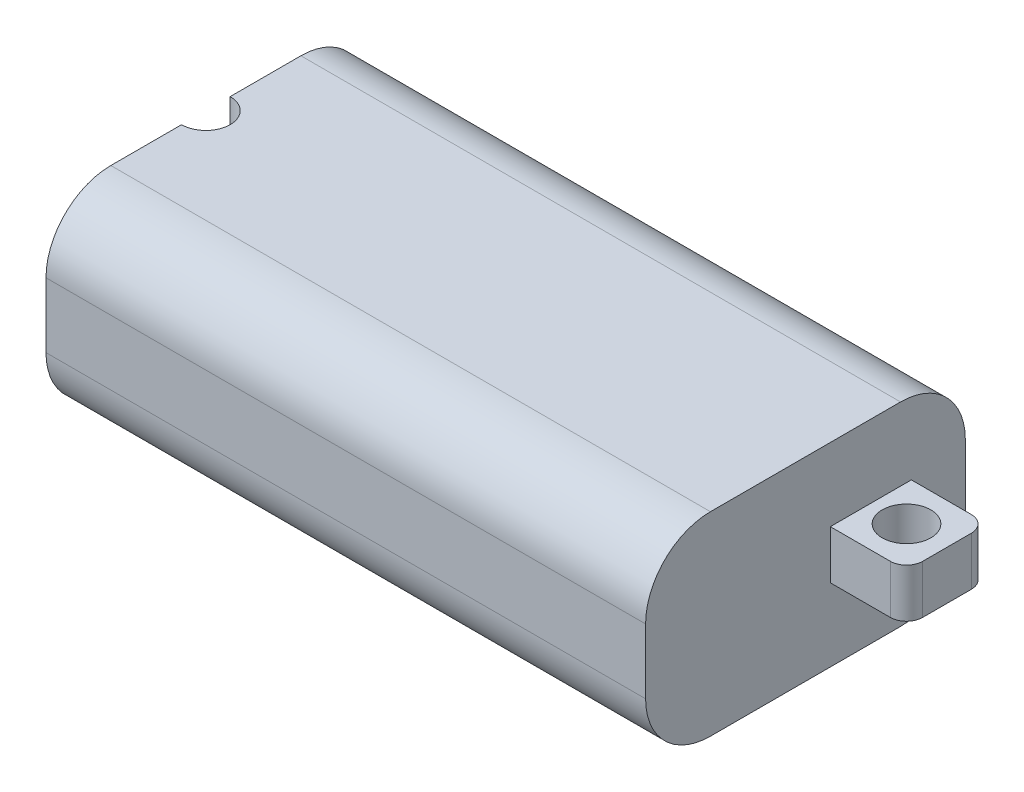
ISO-10303-21;
HEADER;
FILE_DESCRIPTION(('STEP AP214'),'2;1');
FILE_NAME('part.step','',(''),(''),'','','');
FILE_SCHEMA(('AUTOMOTIVE_DESIGN { 1 0 10303 214 1 1 1 1 }'));
ENDSEC;
DATA;
#1=APPLICATION_CONTEXT('core data for automotive mechanical design processes');
#2=APPLICATION_PROTOCOL_DEFINITION('international standard','automotive_design',2000,#1);
#3=PRODUCT_CONTEXT('',#1,'mechanical');
#4=PRODUCT('Part','Part','',(#3));
#5=PRODUCT_RELATED_PRODUCT_CATEGORY('part','',(#4));
#6=PRODUCT_DEFINITION_FORMATION('','',#4);
#7=PRODUCT_DEFINITION_CONTEXT('part definition',#1,'design');
#8=PRODUCT_DEFINITION('design','',#6,#7);
#9=PRODUCT_DEFINITION_SHAPE('','',#8);
#10=(LENGTH_UNIT() NAMED_UNIT(*) SI_UNIT(.MILLI.,.METRE.));
#11=(NAMED_UNIT(*) PLANE_ANGLE_UNIT() SI_UNIT($,.RADIAN.));
#12=(NAMED_UNIT(*) SI_UNIT($,.STERADIAN.) SOLID_ANGLE_UNIT());
#13=UNCERTAINTY_MEASURE_WITH_UNIT(LENGTH_MEASURE(1.E-05),#10,'distance_accuracy_value','');
#14=(GEOMETRIC_REPRESENTATION_CONTEXT(3) GLOBAL_UNCERTAINTY_ASSIGNED_CONTEXT((#13)) GLOBAL_UNIT_ASSIGNED_CONTEXT((#10,
#11,#12)) REPRESENTATION_CONTEXT('',''));
#15=CARTESIAN_POINT('',(0.,0.,0.));
#16=DIRECTION('',(0.,0.,1.));
#17=DIRECTION('',(1.,0.,0.));
#18=AXIS2_PLACEMENT_3D('',#15,#16,#17);
#19=CARTESIAN_POINT('',(18.5,12.,9.86499999999999));
#20=DIRECTION('',(-1.,0.,0.));
#21=DIRECTION('',(0.,0.,1.));
#22=AXIS2_PLACEMENT_3D('',#19,#20,#21);
#23=PLANE('',#22);
#24=DIRECTION('',(0.,0.,-1.));
#25=VECTOR('',#24,1.);
#26=CARTESIAN_POINT('',(18.5,0.,9.86499999999999));
#27=LINE('',#26,#25);
#28=CARTESIAN_POINT('',(18.5,0.,5.86499999999999));
#29=VERTEX_POINT('',#28);
#30=CARTESIAN_POINT('',(18.5,0.,-5.86500000000001));
#31=VERTEX_POINT('',#30);
#32=EDGE_CURVE('E234',#29,#31,#27,.T.);
#33=ORIENTED_EDGE('',*,*,#32,.T.);
#34=CARTESIAN_POINT('',(18.5,4.,-5.86500000000001));
#35=DIRECTION('',(-1.,0.,0.));
#36=DIRECTION('',(0.,0.,1.));
#37=AXIS2_PLACEMENT_3D('',#34,#35,#36);
#38=CIRCLE('',#37,4.);
#39=CARTESIAN_POINT('',(18.5,4.,-9.86500000000001));
#40=VERTEX_POINT('',#39);
#41=EDGE_CURVE('E281',#31,#40,#38,.F.);
#42=ORIENTED_EDGE('',*,*,#41,.T.);
#43=DIRECTION('',(0.,-1.,0.));
#44=VECTOR('',#43,1.);
#45=CARTESIAN_POINT('',(18.5,12.,-9.86500000000001));
#46=LINE('',#45,#44);
#47=CARTESIAN_POINT('',(18.5,8.,-9.86500000000001));
#48=VERTEX_POINT('',#47);
#49=EDGE_CURVE('E241',#48,#40,#46,.T.);
#50=ORIENTED_EDGE('',*,*,#49,.F.);
#51=CARTESIAN_POINT('',(18.5,8.,-5.86500000000001));
#52=DIRECTION('',(-1.,0.,0.));
#53=DIRECTION('',(0.,0.,1.));
#54=AXIS2_PLACEMENT_3D('',#51,#52,#53);
#55=CIRCLE('',#54,4.);
#56=CARTESIAN_POINT('',(18.5,12.,-5.86500000000001));
#57=VERTEX_POINT('',#56);
#58=EDGE_CURVE('E278',#48,#57,#55,.F.);
#59=ORIENTED_EDGE('',*,*,#58,.T.);
#60=DIRECTION('',(0.,0.,-1.));
#61=VECTOR('',#60,1.);
#62=CARTESIAN_POINT('',(18.5,12.,9.86499999999999));
#63=LINE('',#62,#61);
#64=CARTESIAN_POINT('',(18.5,12.,5.86499999999999));
#65=VERTEX_POINT('',#64);
#66=EDGE_CURVE('E225',#65,#57,#63,.T.);
#67=ORIENTED_EDGE('',*,*,#66,.F.);
#68=CARTESIAN_POINT('',(18.5,8.,5.86499999999999));
#69=DIRECTION('',(-1.,0.,0.));
#70=DIRECTION('',(0.,0.,1.));
#71=AXIS2_PLACEMENT_3D('',#68,#69,#70);
#72=CIRCLE('',#71,4.);
#73=CARTESIAN_POINT('',(18.5,8.,9.86499999999999));
#74=VERTEX_POINT('',#73);
#75=EDGE_CURVE('E272',#65,#74,#72,.F.);
#76=ORIENTED_EDGE('',*,*,#75,.T.);
#77=DIRECTION('',(0.,-1.,0.));
#78=VECTOR('',#77,1.);
#79=CARTESIAN_POINT('',(18.5,12.,9.86499999999999));
#80=LINE('',#79,#78);
#81=CARTESIAN_POINT('',(18.5,4.,9.86499999999999));
#82=VERTEX_POINT('',#81);
#83=EDGE_CURVE('E245',#74,#82,#80,.T.);
#84=ORIENTED_EDGE('',*,*,#83,.T.);
#85=CARTESIAN_POINT('',(18.5,4.,5.86499999999999));
#86=DIRECTION('',(-1.,0.,0.));
#87=DIRECTION('',(0.,0.,1.));
#88=AXIS2_PLACEMENT_3D('',#85,#86,#87);
#89=CIRCLE('',#88,4.);
#90=EDGE_CURVE('E275',#82,#29,#89,.F.);
#91=ORIENTED_EDGE('',*,*,#90,.T.);
#92=EDGE_LOOP('',(#33,#42,#50,#59,#67,#76,#84,#91));
#93=FACE_BOUND('',#92,.T.);
#94=DIRECTION('',(0.,1.,0.));
#95=VECTOR('',#94,1.);
#96=CARTESIAN_POINT('',(18.5,4.5,-6.53500000000001));
#97=LINE('',#96,#95);
#98=CARTESIAN_POINT('',(18.5,4.5,-6.53500000000001));
#99=VERTEX_POINT('',#98);
#100=CARTESIAN_POINT('',(18.5,7.5,-6.535));
#101=VERTEX_POINT('',#100);
#102=EDGE_CURVE('E156',#99,#101,#97,.T.);
#103=ORIENTED_EDGE('',*,*,#102,.F.);
#104=DIRECTION('',(0.,0.,-1.));
#105=VECTOR('',#104,1.);
#106=CARTESIAN_POINT('',(18.5,4.5,-1.53500000000001));
#107=LINE('',#106,#105);
#108=CARTESIAN_POINT('',(18.5,4.5,-1.53500000000001));
#109=VERTEX_POINT('',#108);
#110=EDGE_CURVE('E169',#109,#99,#107,.T.);
#111=ORIENTED_EDGE('',*,*,#110,.F.);
#112=DIRECTION('',(0.,-1.,0.));
#113=VECTOR('',#112,1.);
#114=CARTESIAN_POINT('',(18.5,4.5,-1.53500000000001));
#115=LINE('',#114,#113);
#116=CARTESIAN_POINT('',(18.5,7.5,-1.53500000000001));
#117=VERTEX_POINT('',#116);
#118=EDGE_CURVE('E180',#117,#109,#115,.T.);
#119=ORIENTED_EDGE('',*,*,#118,.F.);
#120=DIRECTION('',(0.,0.,1.));
#121=VECTOR('',#120,1.);
#122=CARTESIAN_POINT('',(18.5,7.5,-1.53500000000001));
#123=LINE('',#122,#121);
#124=EDGE_CURVE('E172',#101,#117,#123,.T.);
#125=ORIENTED_EDGE('',*,*,#124,.F.);
#126=EDGE_LOOP('',(#103,#111,#119,#125));
#127=FACE_BOUND('',#126,.T.);
#128=ADVANCED_FACE('F39',(#93,#127),#23,.F.);
#129=CARTESIAN_POINT('',(-18.5,12.,9.865));
#130=DIRECTION('',(1.,0.,0.));
#131=DIRECTION('',(0.,0.,-1.));
#132=AXIS2_PLACEMENT_3D('',#129,#130,#131);
#133=PLANE('',#132);
#134=CARTESIAN_POINT('',(-18.5,6.,-4.035));
#135=DIRECTION('',(-1.,0.,0.));
#136=DIRECTION('',(0.,0.,1.));
#137=AXIS2_PLACEMENT_3D('',#134,#135,#136);
#138=CIRCLE('',#137,2.5);
#139=CARTESIAN_POINT('',(-18.5,6.,-1.535));
#140=VERTEX_POINT('',#139);
#141=EDGE_CURVE('E197',#140,#140,#138,.T.);
#142=ORIENTED_EDGE('',*,*,#141,.F.);
#143=EDGE_LOOP('',(#142));
#144=FACE_BOUND('',#143,.T.);
#145=DIRECTION('',(0.,-1.,0.));
#146=VECTOR('',#145,1.);
#147=CARTESIAN_POINT('',(-18.5,12.,-9.865));
#148=LINE('',#147,#146);
#149=CARTESIAN_POINT('',(-18.5,8.,-9.865));
#150=VERTEX_POINT('',#149);
#151=CARTESIAN_POINT('',(-18.5,4.,-9.865));
#152=VERTEX_POINT('',#151);
#153=EDGE_CURVE('E230',#150,#152,#148,.T.);
#154=ORIENTED_EDGE('',*,*,#153,.T.);
#155=CARTESIAN_POINT('',(-18.5,4.,-5.865));
#156=DIRECTION('',(1.,0.,0.));
#157=DIRECTION('',(0.,0.,-1.));
#158=AXIS2_PLACEMENT_3D('',#155,#156,#157);
#159=CIRCLE('',#158,4.);
#160=CARTESIAN_POINT('',(-18.5,0.,-5.86499999999999));
#161=VERTEX_POINT('',#160);
#162=EDGE_CURVE('E263',#152,#161,#159,.F.);
#163=ORIENTED_EDGE('',*,*,#162,.T.);
#164=DIRECTION('',(0.,0.,1.));
#165=VECTOR('',#164,1.);
#166=CARTESIAN_POINT('',(-18.5,0.,9.865));
#167=LINE('',#166,#165);
#168=CARTESIAN_POINT('',(-18.5,0.,-1.50000000000001));
#169=VERTEX_POINT('',#168);
#170=EDGE_CURVE('E231',#161,#169,#167,.T.);
#171=ORIENTED_EDGE('',*,*,#170,.T.);
#172=DIRECTION('',(0.,1.,0.));
#173=VECTOR('',#172,1.);
#174=CARTESIAN_POINT('',(-18.5,0.,-1.50000000000001));
#175=LINE('',#174,#173);
#176=CARTESIAN_POINT('',(-18.5,12.,-1.50000000000001));
#177=VERTEX_POINT('',#176);
#178=EDGE_CURVE('E217',#169,#177,#175,.T.);
#179=ORIENTED_EDGE('',*,*,#178,.T.);
#180=DIRECTION('',(0.,0.,1.));
#181=VECTOR('',#180,1.);
#182=CARTESIAN_POINT('',(-18.5,12.,9.865));
#183=LINE('',#182,#181);
#184=CARTESIAN_POINT('',(-18.5,12.,-5.86499999999999));
#185=VERTEX_POINT('',#184);
#186=EDGE_CURVE('E222',#185,#177,#183,.T.);
#187=ORIENTED_EDGE('',*,*,#186,.F.);
#188=CARTESIAN_POINT('',(-18.5,8.,-5.865));
#189=DIRECTION('',(1.,0.,0.));
#190=DIRECTION('',(0.,0.,-1.));
#191=AXIS2_PLACEMENT_3D('',#188,#189,#190);
#192=CIRCLE('',#191,4.);
#193=EDGE_CURVE('E260',#185,#150,#192,.F.);
#194=ORIENTED_EDGE('',*,*,#193,.T.);
#195=EDGE_LOOP('',(#154,#163,#171,#179,#187,#194));
#196=FACE_BOUND('',#195,.T.);
#197=ADVANCED_FACE('F358',(#144,#196),#133,.F.);
#198=CARTESIAN_POINT('',(-18.5,0.,1.5));
#199=VERTEX_POINT('',#198);
#200=CARTESIAN_POINT('',(-18.5,0.,5.865));
#201=VERTEX_POINT('',#200);
#202=EDGE_CURVE('E221',#199,#201,#167,.T.);
#203=ORIENTED_EDGE('',*,*,#202,.T.);
#204=CARTESIAN_POINT('',(-18.5,4.,5.865));
#205=DIRECTION('',(1.,0.,0.));
#206=DIRECTION('',(0.,0.,-1.));
#207=AXIS2_PLACEMENT_3D('',#204,#205,#206);
#208=CIRCLE('',#207,4.);
#209=CARTESIAN_POINT('',(-18.5,4.,9.865));
#210=VERTEX_POINT('',#209);
#211=EDGE_CURVE('E302',#201,#210,#208,.F.);
#212=ORIENTED_EDGE('',*,*,#211,.T.);
#213=DIRECTION('',(0.,-1.,0.));
#214=VECTOR('',#213,1.);
#215=CARTESIAN_POINT('',(-18.5,12.,9.865));
#216=LINE('',#215,#214);
#217=CARTESIAN_POINT('',(-18.5,8.,9.865));
#218=VERTEX_POINT('',#217);
#219=EDGE_CURVE('E249',#218,#210,#216,.T.);
#220=ORIENTED_EDGE('',*,*,#219,.F.);
#221=CARTESIAN_POINT('',(-18.5,8.,5.865));
#222=DIRECTION('',(1.,0.,0.));
#223=DIRECTION('',(0.,0.,-1.));
#224=AXIS2_PLACEMENT_3D('',#221,#222,#223);
#225=CIRCLE('',#224,4.);
#226=CARTESIAN_POINT('',(-18.5,12.,5.865));
#227=VERTEX_POINT('',#226);
#228=EDGE_CURVE('E299',#218,#227,#225,.F.);
#229=ORIENTED_EDGE('',*,*,#228,.T.);
#230=CARTESIAN_POINT('',(-18.5,12.,1.5));
#231=VERTEX_POINT('',#230);
#232=EDGE_CURVE('E226',#231,#227,#183,.T.);
#233=ORIENTED_EDGE('',*,*,#232,.F.);
#234=DIRECTION('',(0.,1.,0.));
#235=VECTOR('',#234,1.);
#236=CARTESIAN_POINT('',(-18.5,0.,1.5));
#237=LINE('',#236,#235);
#238=EDGE_CURVE('E210',#231,#199,#237,.F.);
#239=ORIENTED_EDGE('',*,*,#238,.T.);
#240=EDGE_LOOP('',(#203,#212,#220,#229,#233,#239));
#241=FACE_BOUND('',#240,.T.);
#242=ADVANCED_FACE('F364',(#241),#133,.F.);
#243=CARTESIAN_POINT('',(18.5,12.,9.86499999999999));
#244=DIRECTION('',(0.,0.,-1.));
#245=DIRECTION('',(-1.,0.,0.));
#246=AXIS2_PLACEMENT_3D('',#243,#244,#245);
#247=PLANE('',#246);
#248=ORIENTED_EDGE('',*,*,#219,.T.);
#249=DIRECTION('',(1.,0.,0.));
#250=VECTOR('',#249,1.);
#251=CARTESIAN_POINT('',(18.5,4.,9.86499999999999));
#252=LINE('',#251,#250);
#253=EDGE_CURVE('E295',#210,#82,#252,.T.);
#254=ORIENTED_EDGE('',*,*,#253,.T.);
#255=ORIENTED_EDGE('',*,*,#83,.F.);
#256=DIRECTION('',(1.,0.,0.));
#257=VECTOR('',#256,1.);
#258=CARTESIAN_POINT('',(-18.5,8.,9.865));
#259=LINE('',#258,#257);
#260=EDGE_CURVE('E292',#74,#218,#259,.F.);
#261=ORIENTED_EDGE('',*,*,#260,.T.);
#262=EDGE_LOOP('',(#248,#254,#255,#261));
#263=FACE_BOUND('',#262,.T.);
#264=ADVANCED_FACE('F371',(#263),#247,.F.);
#265=CARTESIAN_POINT('',(18.5,12.,-9.86500000000001));
#266=DIRECTION('',(0.,0.,1.));
#267=DIRECTION('',(1.,0.,0.));
#268=AXIS2_PLACEMENT_3D('',#265,#266,#267);
#269=PLANE('',#268);
#270=ORIENTED_EDGE('',*,*,#49,.T.);
#271=DIRECTION('',(-1.,0.,0.));
#272=VECTOR('',#271,1.);
#273=CARTESIAN_POINT('',(18.5,4.,-9.86500000000001));
#274=LINE('',#273,#272);
#275=EDGE_CURVE('E256',#40,#152,#274,.T.);
#276=ORIENTED_EDGE('',*,*,#275,.T.);
#277=ORIENTED_EDGE('',*,*,#153,.F.);
#278=DIRECTION('',(-1.,0.,0.));
#279=VECTOR('',#278,1.);
#280=CARTESIAN_POINT('',(18.5,8.,-9.86500000000001));
#281=LINE('',#280,#279);
#282=EDGE_CURVE('E253',#150,#48,#281,.F.);
#283=ORIENTED_EDGE('',*,*,#282,.T.);
#284=EDGE_LOOP('',(#270,#276,#277,#283));
#285=FACE_BOUND('',#284,.T.);
#286=ADVANCED_FACE('F369',(#285),#269,.F.);
#287=CARTESIAN_POINT('',(0.,12.,0.));
#288=DIRECTION('',(0.,1.,0.));
#289=DIRECTION('',(0.,0.,1.));
#290=AXIS2_PLACEMENT_3D('',#287,#288,#289);
#291=PLANE('',#290);
#292=ORIENTED_EDGE('',*,*,#66,.T.);
#293=DIRECTION('',(-1.,0.,0.));
#294=VECTOR('',#293,1.);
#295=CARTESIAN_POINT('',(-18.5,12.,-5.865));
#296=LINE('',#295,#294);
#297=EDGE_CURVE('E288',#57,#185,#296,.T.);
#298=ORIENTED_EDGE('',*,*,#297,.T.);
#299=ORIENTED_EDGE('',*,*,#186,.T.);
#300=CARTESIAN_POINT('',(-18.5,12.,0.));
#301=DIRECTION('',(0.,1.,0.));
#302=DIRECTION('',(0.,0.,1.));
#303=AXIS2_PLACEMENT_3D('',#300,#301,#302);
#304=CIRCLE('',#303,1.5);
#305=EDGE_CURVE('E202',#231,#177,#304,.T.);
#306=ORIENTED_EDGE('',*,*,#305,.F.);
#307=ORIENTED_EDGE('',*,*,#232,.T.);
#308=DIRECTION('',(1.,0.,0.));
#309=VECTOR('',#308,1.);
#310=CARTESIAN_POINT('',(18.5,12.,5.86499999999999));
#311=LINE('',#310,#309);
#312=EDGE_CURVE('E284',#227,#65,#311,.T.);
#313=ORIENTED_EDGE('',*,*,#312,.T.);
#314=EDGE_LOOP('',(#292,#298,#299,#306,#307,#313));
#315=FACE_BOUND('',#314,.T.);
#316=ADVANCED_FACE('F497',(#315),#291,.T.);
#317=CARTESIAN_POINT('',(0.,0.,0.));
#318=DIRECTION('',(0.,1.,0.));
#319=DIRECTION('',(0.,0.,1.));
#320=AXIS2_PLACEMENT_3D('',#317,#318,#319);
#321=PLANE('',#320);
#322=ORIENTED_EDGE('',*,*,#170,.F.);
#323=DIRECTION('',(-1.,0.,0.));
#324=VECTOR('',#323,1.);
#325=CARTESIAN_POINT('',(0.,0.,-5.86500000000001));
#326=LINE('',#325,#324);
#327=EDGE_CURVE('E269',#161,#31,#326,.F.);
#328=ORIENTED_EDGE('',*,*,#327,.T.);
#329=ORIENTED_EDGE('',*,*,#32,.F.);
#330=DIRECTION('',(1.,0.,0.));
#331=VECTOR('',#330,1.);
#332=CARTESIAN_POINT('',(0.,0.,5.865));
#333=LINE('',#332,#331);
#334=EDGE_CURVE('E266',#29,#201,#333,.F.);
#335=ORIENTED_EDGE('',*,*,#334,.T.);
#336=ORIENTED_EDGE('',*,*,#202,.F.);
#337=CARTESIAN_POINT('',(-18.5,0.,0.));
#338=DIRECTION('',(0.,1.,0.));
#339=DIRECTION('',(0.,0.,1.));
#340=AXIS2_PLACEMENT_3D('',#337,#338,#339);
#341=CIRCLE('',#340,1.5);
#342=EDGE_CURVE('E206',#199,#169,#341,.T.);
#343=ORIENTED_EDGE('',*,*,#342,.T.);
#344=EDGE_LOOP('',(#322,#328,#329,#335,#336,#343));
#345=FACE_BOUND('',#344,.T.);
#346=ADVANCED_FACE('F489',(#345),#321,.F.);
#347=CARTESIAN_POINT('',(-18.5,0.,0.));
#348=DIRECTION('',(0.,1.,0.));
#349=DIRECTION('',(0.,0.,1.));
#350=AXIS2_PLACEMENT_3D('',#347,#348,#349);
#351=CYLINDRICAL_SURFACE('',#350,1.5);
#352=ORIENTED_EDGE('',*,*,#342,.F.);
#353=ORIENTED_EDGE('',*,*,#238,.F.);
#354=ORIENTED_EDGE('',*,*,#305,.T.);
#355=ORIENTED_EDGE('',*,*,#178,.F.);
#356=EDGE_LOOP('',(#352,#353,#354,#355));
#357=FACE_BOUND('',#356,.T.);
#358=ADVANCED_FACE('F381',(#357),#351,.F.);
#359=CARTESIAN_POINT('',(18.5,4.,-5.86500000000001));
#360=DIRECTION('',(-1.,0.,0.));
#361=DIRECTION('',(0.,0.,1.));
#362=AXIS2_PLACEMENT_3D('',#359,#360,#361);
#363=CYLINDRICAL_SURFACE('',#362,4.);
#364=ORIENTED_EDGE('',*,*,#41,.F.);
#365=ORIENTED_EDGE('',*,*,#327,.F.);
#366=ORIENTED_EDGE('',*,*,#162,.F.);
#367=ORIENTED_EDGE('',*,*,#275,.F.);
#368=EDGE_LOOP('',(#364,#365,#366,#367));
#369=FACE_BOUND('',#368,.T.);
#370=ADVANCED_FACE('F377',(#369),#363,.T.);
#371=CARTESIAN_POINT('',(0.,8.,-5.86500000000001));
#372=DIRECTION('',(1.,0.,0.));
#373=DIRECTION('',(0.,0.,-1.));
#374=AXIS2_PLACEMENT_3D('',#371,#372,#373);
#375=CYLINDRICAL_SURFACE('',#374,4.);
#376=ORIENTED_EDGE('',*,*,#58,.F.);
#377=ORIENTED_EDGE('',*,*,#282,.F.);
#378=ORIENTED_EDGE('',*,*,#193,.F.);
#379=ORIENTED_EDGE('',*,*,#297,.F.);
#380=EDGE_LOOP('',(#376,#377,#378,#379));
#381=FACE_BOUND('',#380,.T.);
#382=ADVANCED_FACE('F380',(#381),#375,.T.);
#383=CARTESIAN_POINT('',(18.5,4.,5.86499999999999));
#384=DIRECTION('',(1.,0.,0.));
#385=DIRECTION('',(0.,0.,-1.));
#386=AXIS2_PLACEMENT_3D('',#383,#384,#385);
#387=CYLINDRICAL_SURFACE('',#386,4.);
#388=ORIENTED_EDGE('',*,*,#211,.F.);
#389=ORIENTED_EDGE('',*,*,#334,.F.);
#390=ORIENTED_EDGE('',*,*,#90,.F.);
#391=ORIENTED_EDGE('',*,*,#253,.F.);
#392=EDGE_LOOP('',(#388,#389,#390,#391));
#393=FACE_BOUND('',#392,.T.);
#394=ADVANCED_FACE('F385',(#393),#387,.T.);
#395=CARTESIAN_POINT('',(0.,8.,5.865));
#396=DIRECTION('',(-1.,0.,0.));
#397=DIRECTION('',(0.,0.,1.));
#398=AXIS2_PLACEMENT_3D('',#395,#396,#397);
#399=CYLINDRICAL_SURFACE('',#398,4.);
#400=ORIENTED_EDGE('',*,*,#228,.F.);
#401=ORIENTED_EDGE('',*,*,#260,.F.);
#402=ORIENTED_EDGE('',*,*,#75,.F.);
#403=ORIENTED_EDGE('',*,*,#312,.F.);
#404=EDGE_LOOP('',(#400,#401,#402,#403));
#405=FACE_BOUND('',#404,.T.);
#406=ADVANCED_FACE('F389',(#405),#399,.T.);
#407=CARTESIAN_POINT('',(11.5,6.,-4.035));
#408=DIRECTION('',(-1.,0.,0.));
#409=DIRECTION('',(0.,0.,1.));
#410=AXIS2_PLACEMENT_3D('',#407,#408,#409);
#411=CYLINDRICAL_SURFACE('',#410,2.5);
#412=CARTESIAN_POINT('',(11.5,6.,-4.035));
#413=DIRECTION('',(-1.,0.,0.));
#414=DIRECTION('',(0.,0.,1.));
#415=AXIS2_PLACEMENT_3D('',#412,#413,#414);
#416=CIRCLE('',#415,2.5);
#417=CARTESIAN_POINT('',(11.5,6.,-1.535));
#418=VERTEX_POINT('',#417);
#419=EDGE_CURVE('E198',#418,#418,#416,.T.);
#420=ORIENTED_EDGE('',*,*,#419,.F.);
#421=EDGE_LOOP('',(#420));
#422=FACE_BOUND('',#421,.T.);
#423=ORIENTED_EDGE('',*,*,#141,.T.);
#424=EDGE_LOOP('',(#423));
#425=FACE_BOUND('',#424,.T.);
#426=ADVANCED_FACE('F392',(#422,#425),#411,.F.);
#427=CARTESIAN_POINT('',(11.5,6.,-4.035));
#428=DIRECTION('',(-1.,0.,0.));
#429=DIRECTION('',(0.,0.,1.));
#430=AXIS2_PLACEMENT_3D('',#427,#428,#429);
#431=PLANE('',#430);
#432=ORIENTED_EDGE('',*,*,#419,.T.);
#433=EDGE_LOOP('',(#432));
#434=FACE_BOUND('',#433,.T.);
#435=ADVANCED_FACE('F355',(#434),#431,.T.);
#436=CARTESIAN_POINT('',(23.2,4.5,-6.53500000000001));
#437=DIRECTION('',(0.,0.,1.));
#438=DIRECTION('',(1.,0.,0.));
#439=AXIS2_PLACEMENT_3D('',#436,#437,#438);
#440=PLANE('',#439);
#441=DIRECTION('',(-1.,0.,0.));
#442=VECTOR('',#441,1.);
#443=CARTESIAN_POINT('',(23.2,7.5,-6.53500000000001));
#444=LINE('',#443,#442);
#445=CARTESIAN_POINT('',(22.2,7.5,-6.53500000000001));
#446=VERTEX_POINT('',#445);
#447=EDGE_CURVE('E194',#446,#101,#444,.T.);
#448=ORIENTED_EDGE('',*,*,#447,.F.);
#449=DIRECTION('',(0.,1.,0.));
#450=VECTOR('',#449,1.);
#451=CARTESIAN_POINT('',(22.2,4.5,-6.53500000000001));
#452=LINE('',#451,#450);
#453=CARTESIAN_POINT('',(22.2,4.5,-6.53500000000001));
#454=VERTEX_POINT('',#453);
#455=EDGE_CURVE('E11',#446,#454,#452,.F.);
#456=ORIENTED_EDGE('',*,*,#455,.T.);
#457=DIRECTION('',(-1.,0.,0.));
#458=VECTOR('',#457,1.);
#459=CARTESIAN_POINT('',(23.2,4.5,-6.53500000000001));
#460=LINE('',#459,#458);
#461=EDGE_CURVE('E153',#454,#99,#460,.T.);
#462=ORIENTED_EDGE('',*,*,#461,.T.);
#463=ORIENTED_EDGE('',*,*,#102,.T.);
#464=EDGE_LOOP('',(#448,#456,#462,#463));
#465=FACE_BOUND('',#464,.T.);
#466=ADVANCED_FACE('F155',(#465),#440,.F.);
#467=CARTESIAN_POINT('',(23.2,7.5,-1.53500000000001));
#468=DIRECTION('',(0.,-1.,0.));
#469=DIRECTION('',(0.,0.,-1.));
#470=AXIS2_PLACEMENT_3D('',#467,#468,#469);
#471=PLANE('',#470);
#472=CARTESIAN_POINT('',(20.7,7.5,-4.03500000000001));
#473=DIRECTION('',(0.,1.,0.));
#474=DIRECTION('',(0.,0.,1.));
#475=AXIS2_PLACEMENT_3D('',#472,#473,#474);
#476=CIRCLE('',#475,1.5);
#477=CARTESIAN_POINT('',(20.7,7.5,-2.53500000000001));
#478=VERTEX_POINT('',#477);
#479=EDGE_CURVE('E309',#478,#478,#476,.T.);
#480=ORIENTED_EDGE('',*,*,#479,.F.);
#481=EDGE_LOOP('',(#480));
#482=FACE_BOUND('',#481,.T.);
#483=DIRECTION('',(-1.,0.,0.));
#484=VECTOR('',#483,1.);
#485=CARTESIAN_POINT('',(23.2,7.5,-1.53500000000001));
#486=LINE('',#485,#484);
#487=CARTESIAN_POINT('',(22.2,7.5,-1.53500000000001));
#488=VERTEX_POINT('',#487);
#489=EDGE_CURVE('E191',#488,#117,#486,.T.);
#490=ORIENTED_EDGE('',*,*,#489,.F.);
#491=CARTESIAN_POINT('',(22.2,7.5,-2.53500000000001));
#492=DIRECTION('',(0.,-1.,0.));
#493=DIRECTION('',(0.,0.,-1.));
#494=AXIS2_PLACEMENT_3D('',#491,#492,#493);
#495=CIRCLE('',#494,1.);
#496=CARTESIAN_POINT('',(23.2,7.5,-2.53500000000001));
#497=VERTEX_POINT('',#496);
#498=EDGE_CURVE('E48',#488,#497,#495,.F.);
#499=ORIENTED_EDGE('',*,*,#498,.T.);
#500=DIRECTION('',(0.,0.,1.));
#501=VECTOR('',#500,1.);
#502=CARTESIAN_POINT('',(23.2,7.5,-1.53500000000001));
#503=LINE('',#502,#501);
#504=CARTESIAN_POINT('',(23.2,7.5,-5.53500000000001));
#505=VERTEX_POINT('',#504);
#506=EDGE_CURVE('E179',#505,#497,#503,.T.);
#507=ORIENTED_EDGE('',*,*,#506,.F.);
#508=CARTESIAN_POINT('',(22.2,7.5,-5.53500000000001));
#509=DIRECTION('',(0.,-1.,0.));
#510=DIRECTION('',(0.,0.,-1.));
#511=AXIS2_PLACEMENT_3D('',#508,#509,#510);
#512=CIRCLE('',#511,1.);
#513=EDGE_CURVE('E55',#505,#446,#512,.F.);
#514=ORIENTED_EDGE('',*,*,#513,.T.);
#515=ORIENTED_EDGE('',*,*,#447,.T.);
#516=ORIENTED_EDGE('',*,*,#124,.T.);
#517=EDGE_LOOP('',(#490,#499,#507,#514,#515,#516));
#518=FACE_BOUND('',#517,.T.);
#519=ADVANCED_FACE('F328',(#482,#518),#471,.F.);
#520=CARTESIAN_POINT('',(23.2,4.5,-1.53500000000001));
#521=DIRECTION('',(0.,0.,-1.));
#522=DIRECTION('',(-1.,0.,0.));
#523=AXIS2_PLACEMENT_3D('',#520,#521,#522);
#524=PLANE('',#523);
#525=DIRECTION('',(-1.,0.,0.));
#526=VECTOR('',#525,1.);
#527=CARTESIAN_POINT('',(23.2,4.5,-1.53500000000001));
#528=LINE('',#527,#526);
#529=CARTESIAN_POINT('',(22.2,4.5,-1.53500000000001));
#530=VERTEX_POINT('',#529);
#531=EDGE_CURVE('E162',#530,#109,#528,.T.);
#532=ORIENTED_EDGE('',*,*,#531,.F.);
#533=DIRECTION('',(0.,-1.,0.));
#534=VECTOR('',#533,1.);
#535=CARTESIAN_POINT('',(22.2,4.5,-1.53500000000001));
#536=LINE('',#535,#534);
#537=EDGE_CURVE('E63',#530,#488,#536,.F.);
#538=ORIENTED_EDGE('',*,*,#537,.T.);
#539=ORIENTED_EDGE('',*,*,#489,.T.);
#540=ORIENTED_EDGE('',*,*,#118,.T.);
#541=EDGE_LOOP('',(#532,#538,#539,#540));
#542=FACE_BOUND('',#541,.T.);
#543=ADVANCED_FACE('F336',(#542),#524,.F.);
#544=CARTESIAN_POINT('',(23.2,4.5,-1.53500000000001));
#545=DIRECTION('',(0.,1.,0.));
#546=DIRECTION('',(0.,0.,1.));
#547=AXIS2_PLACEMENT_3D('',#544,#545,#546);
#548=PLANE('',#547);
#549=CARTESIAN_POINT('',(20.7,4.5,-4.03500000000001));
#550=DIRECTION('',(0.,1.,0.));
#551=DIRECTION('',(0.,0.,1.));
#552=AXIS2_PLACEMENT_3D('',#549,#550,#551);
#553=CIRCLE('',#552,1.5);
#554=CARTESIAN_POINT('',(20.7,4.5,-2.53500000000001));
#555=VERTEX_POINT('',#554);
#556=EDGE_CURVE('E174',#555,#555,#553,.T.);
#557=ORIENTED_EDGE('',*,*,#556,.T.);
#558=EDGE_LOOP('',(#557));
#559=FACE_BOUND('',#558,.T.);
#560=DIRECTION('',(0.,0.,-1.));
#561=VECTOR('',#560,1.);
#562=CARTESIAN_POINT('',(23.2,4.5,-1.53500000000001));
#563=LINE('',#562,#561);
#564=CARTESIAN_POINT('',(23.2,4.5,-2.53500000000001));
#565=VERTEX_POINT('',#564);
#566=CARTESIAN_POINT('',(23.2,4.5,-5.53500000000001));
#567=VERTEX_POINT('',#566);
#568=EDGE_CURVE('E163',#565,#567,#563,.T.);
#569=ORIENTED_EDGE('',*,*,#568,.F.);
#570=CARTESIAN_POINT('',(22.2,4.5,-2.53500000000001));
#571=DIRECTION('',(0.,1.,0.));
#572=DIRECTION('',(0.,0.,1.));
#573=AXIS2_PLACEMENT_3D('',#570,#571,#572);
#574=CIRCLE('',#573,1.);
#575=EDGE_CURVE('E320',#565,#530,#574,.F.);
#576=ORIENTED_EDGE('',*,*,#575,.T.);
#577=ORIENTED_EDGE('',*,*,#531,.T.);
#578=ORIENTED_EDGE('',*,*,#110,.T.);
#579=ORIENTED_EDGE('',*,*,#461,.F.);
#580=CARTESIAN_POINT('',(22.2,4.5,-5.53500000000001));
#581=DIRECTION('',(0.,1.,0.));
#582=DIRECTION('',(0.,0.,1.));
#583=AXIS2_PLACEMENT_3D('',#580,#581,#582);
#584=CIRCLE('',#583,1.);
#585=EDGE_CURVE('E317',#454,#567,#584,.F.);
#586=ORIENTED_EDGE('',*,*,#585,.T.);
#587=EDGE_LOOP('',(#569,#576,#577,#578,#579,#586));
#588=FACE_BOUND('',#587,.T.);
#589=ADVANCED_FACE('F177',(#559,#588),#548,.F.);
#590=CARTESIAN_POINT('',(23.2,0.,0.));
#591=DIRECTION('',(-1.,0.,0.));
#592=DIRECTION('',(0.,0.,1.));
#593=AXIS2_PLACEMENT_3D('',#590,#591,#592);
#594=PLANE('',#593);
#595=ORIENTED_EDGE('',*,*,#506,.T.);
#596=DIRECTION('',(0.,-1.,0.));
#597=VECTOR('',#596,1.);
#598=CARTESIAN_POINT('',(23.2,0.,-2.53500000000001));
#599=LINE('',#598,#597);
#600=EDGE_CURVE('E313',#497,#565,#599,.T.);
#601=ORIENTED_EDGE('',*,*,#600,.T.);
#602=ORIENTED_EDGE('',*,*,#568,.T.);
#603=DIRECTION('',(0.,1.,0.));
#604=VECTOR('',#603,1.);
#605=CARTESIAN_POINT('',(23.2,0.,-5.53500000000001));
#606=LINE('',#605,#604);
#607=EDGE_CURVE('E305',#567,#505,#606,.T.);
#608=ORIENTED_EDGE('',*,*,#607,.T.);
#609=EDGE_LOOP('',(#595,#601,#602,#608));
#610=FACE_BOUND('',#609,.T.);
#611=ADVANCED_FACE('F332',(#610),#594,.F.);
#612=CARTESIAN_POINT('',(20.7,0.,-4.03500000000001));
#613=DIRECTION('',(0.,1.,0.));
#614=DIRECTION('',(0.,0.,1.));
#615=AXIS2_PLACEMENT_3D('',#612,#613,#614);
#616=CYLINDRICAL_SURFACE('',#615,1.5);
#617=ORIENTED_EDGE('',*,*,#479,.T.);
#618=EDGE_LOOP('',(#617));
#619=FACE_BOUND('',#618,.T.);
#620=ORIENTED_EDGE('',*,*,#556,.F.);
#621=EDGE_LOOP('',(#620));
#622=FACE_BOUND('',#621,.T.);
#623=ADVANCED_FACE('F345',(#619,#622),#616,.F.);
#624=CARTESIAN_POINT('',(22.2,0.,-2.53500000000001));
#625=DIRECTION('',(0.,-1.,0.));
#626=DIRECTION('',(0.,0.,-1.));
#627=AXIS2_PLACEMENT_3D('',#624,#625,#626);
#628=CYLINDRICAL_SURFACE('',#627,1.);
#629=ORIENTED_EDGE('',*,*,#498,.F.);
#630=ORIENTED_EDGE('',*,*,#537,.F.);
#631=ORIENTED_EDGE('',*,*,#575,.F.);
#632=ORIENTED_EDGE('',*,*,#600,.F.);
#633=EDGE_LOOP('',(#629,#630,#631,#632));
#634=FACE_BOUND('',#633,.T.);
#635=ADVANCED_FACE('F335',(#634),#628,.T.);
#636=CARTESIAN_POINT('',(22.2,0.,-5.53500000000001));
#637=DIRECTION('',(0.,1.,0.));
#638=DIRECTION('',(0.,0.,1.));
#639=AXIS2_PLACEMENT_3D('',#636,#637,#638);
#640=CYLINDRICAL_SURFACE('',#639,1.);
#641=ORIENTED_EDGE('',*,*,#585,.F.);
#642=ORIENTED_EDGE('',*,*,#455,.F.);
#643=ORIENTED_EDGE('',*,*,#513,.F.);
#644=ORIENTED_EDGE('',*,*,#607,.F.);
#645=EDGE_LOOP('',(#641,#642,#643,#644));
#646=FACE_BOUND('',#645,.T.);
#647=ADVANCED_FACE('F41',(#646),#640,.T.);
#648=CLOSED_SHELL('',(#128,#197,#242,#264,#286,#316,#346,#358,#370,#382,#394,#406,#426,#435,
#466,#519,#543,#589,#611,#623,#635,#647));
#649=MANIFOLD_SOLID_BREP('B2',#648);
#650=ADVANCED_BREP_SHAPE_REPRESENTATION('',(#18,#649),#14);
#651=SHAPE_DEFINITION_REPRESENTATION(#9,#650);
ENDSEC;
END-ISO-10303-21;
